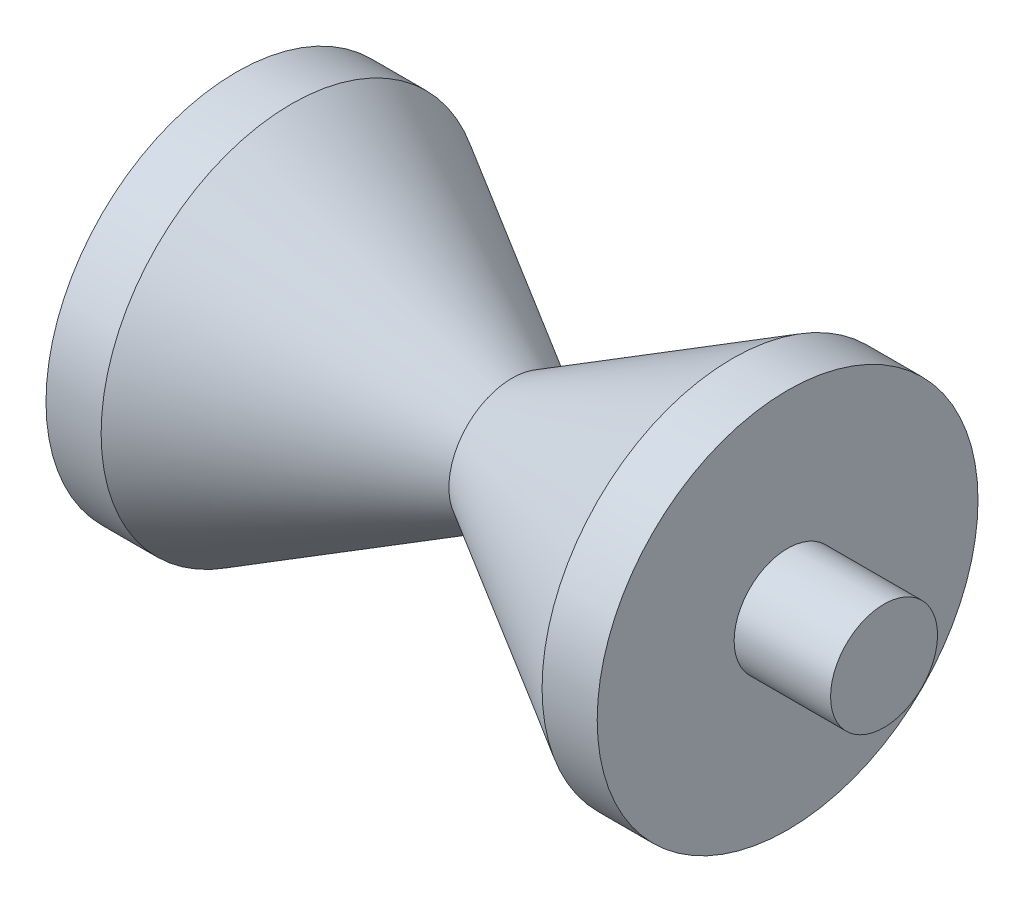
ISO-10303-21;
HEADER;
FILE_DESCRIPTION(('STEP AP214'),'2;1');
FILE_NAME('part.step','',(''),(''),'','','');
FILE_SCHEMA(('AUTOMOTIVE_DESIGN { 1 0 10303 214 1 1 1 1 }'));
ENDSEC;
DATA;
#1=APPLICATION_CONTEXT('core data for automotive mechanical design processes');
#2=APPLICATION_PROTOCOL_DEFINITION('international standard','automotive_design',2000,#1);
#3=PRODUCT_CONTEXT('',#1,'mechanical');
#4=PRODUCT('Part','Part','',(#3));
#5=PRODUCT_RELATED_PRODUCT_CATEGORY('part','',(#4));
#6=PRODUCT_DEFINITION_FORMATION('','',#4);
#7=PRODUCT_DEFINITION_CONTEXT('part definition',#1,'design');
#8=PRODUCT_DEFINITION('design','',#6,#7);
#9=PRODUCT_DEFINITION_SHAPE('','',#8);
#10=(LENGTH_UNIT() NAMED_UNIT(*) SI_UNIT(.MILLI.,.METRE.));
#11=(NAMED_UNIT(*) PLANE_ANGLE_UNIT() SI_UNIT($,.RADIAN.));
#12=(NAMED_UNIT(*) SI_UNIT($,.STERADIAN.) SOLID_ANGLE_UNIT());
#13=UNCERTAINTY_MEASURE_WITH_UNIT(LENGTH_MEASURE(1.E-05),#10,'distance_accuracy_value','');
#14=(GEOMETRIC_REPRESENTATION_CONTEXT(3) GLOBAL_UNCERTAINTY_ASSIGNED_CONTEXT((#13)) GLOBAL_UNIT_ASSIGNED_CONTEXT((#10,
#11,#12)) REPRESENTATION_CONTEXT('',''));
#15=CARTESIAN_POINT('',(0.,0.,0.));
#16=DIRECTION('',(0.,0.,1.));
#17=DIRECTION('',(1.,0.,0.));
#18=AXIS2_PLACEMENT_3D('',#15,#16,#17);
#19=CARTESIAN_POINT('',(6.75,0.,0.));
#20=DIRECTION('',(-1.,0.,0.));
#21=DIRECTION('',(0.,0.,1.));
#22=AXIS2_PLACEMENT_3D('',#19,#20,#21);
#23=PLANE('',#22);
#24=CARTESIAN_POINT('',(6.75,0.,0.));
#25=DIRECTION('',(-1.,0.,0.));
#26=DIRECTION('',(0.,0.,1.));
#27=AXIS2_PLACEMENT_3D('',#24,#25,#26);
#28=CIRCLE('',#27,0.97);
#29=CARTESIAN_POINT('',(6.75,0.,0.97));
#30=VERTEX_POINT('',#29);
#31=EDGE_CURVE('E10',#30,#30,#28,.T.);
#32=ORIENTED_EDGE('',*,*,#31,.F.);
#33=EDGE_LOOP('',(#32));
#34=FACE_BOUND('',#33,.T.);
#35=ADVANCED_FACE('F33',(#34),#23,.F.);
#36=CARTESIAN_POINT('',(0.,0.,0.));
#37=DIRECTION('',(-1.,0.,0.));
#38=DIRECTION('',(0.,0.,1.));
#39=AXIS2_PLACEMENT_3D('',#36,#37,#38);
#40=CYLINDRICAL_SURFACE('',#39,0.97);
#41=CARTESIAN_POINT('',(5.,0.,0.));
#42=DIRECTION('',(-1.,0.,0.));
#43=DIRECTION('',(0.,0.,1.));
#44=AXIS2_PLACEMENT_3D('',#41,#42,#43);
#45=CIRCLE('',#44,0.97);
#46=CARTESIAN_POINT('',(5.,0.,0.97));
#47=VERTEX_POINT('',#46);
#48=EDGE_CURVE('E39',#47,#47,#45,.T.);
#49=ORIENTED_EDGE('',*,*,#48,.F.);
#50=EDGE_LOOP('',(#49));
#51=FACE_BOUND('',#50,.T.);
#52=ORIENTED_EDGE('',*,*,#31,.T.);
#53=EDGE_LOOP('',(#52));
#54=FACE_BOUND('',#53,.T.);
#55=ADVANCED_FACE('F94',(#51,#54),#40,.T.);
#56=CARTESIAN_POINT('',(5.,0.,0.));
#57=DIRECTION('',(-1.,0.,0.));
#58=DIRECTION('',(0.,0.,1.));
#59=AXIS2_PLACEMENT_3D('',#56,#57,#58);
#60=PLANE('',#59);
#61=CARTESIAN_POINT('',(5.,0.,0.));
#62=DIRECTION('',(-1.,0.,0.));
#63=DIRECTION('',(0.,0.,1.));
#64=AXIS2_PLACEMENT_3D('',#61,#62,#63);
#65=CIRCLE('',#64,3.45440107675849);
#66=CARTESIAN_POINT('',(5.,0.,3.45440107675849));
#67=VERTEX_POINT('',#66);
#68=EDGE_CURVE('E43',#67,#67,#65,.T.);
#69=ORIENTED_EDGE('',*,*,#68,.F.);
#70=EDGE_LOOP('',(#69));
#71=FACE_BOUND('',#70,.T.);
#72=ORIENTED_EDGE('',*,*,#48,.T.);
#73=EDGE_LOOP('',(#72));
#74=FACE_BOUND('',#73,.T.);
#75=ADVANCED_FACE('F90',(#71,#74),#60,.F.);
#76=CARTESIAN_POINT('',(0.,0.,0.));
#77=DIRECTION('',(-1.,0.,0.));
#78=DIRECTION('',(0.,0.,1.));
#79=AXIS2_PLACEMENT_3D('',#76,#77,#78);
#80=CYLINDRICAL_SURFACE('',#79,3.45440107675849);
#81=CARTESIAN_POINT('',(4.,0.,0.));
#82=DIRECTION('',(-1.,0.,0.));
#83=DIRECTION('',(0.,0.,1.));
#84=AXIS2_PLACEMENT_3D('',#81,#82,#83);
#85=CIRCLE('',#84,3.45440107675849);
#86=CARTESIAN_POINT('',(4.,0.,-3.45440107675849));
#87=VERTEX_POINT('',#86);
#88=EDGE_CURVE('E47',#87,#87,#85,.T.);
#89=ORIENTED_EDGE('',*,*,#88,.F.);
#90=EDGE_LOOP('',(#89));
#91=FACE_BOUND('',#90,.T.);
#92=ORIENTED_EDGE('',*,*,#68,.T.);
#93=EDGE_LOOP('',(#92));
#94=FACE_BOUND('',#93,.T.);
#95=ADVANCED_FACE('F80',(#91,#94),#80,.T.);
#96=CARTESIAN_POINT('',(0.,0.,0.));
#97=DIRECTION('',(1.,0.,0.));
#98=DIRECTION('',(0.,0.,-1.));
#99=AXIS2_PLACEMENT_3D('',#96,#97,#98);
#100=CONICAL_SURFACE('',#99,1.145,0.523598775598297);
#101=CARTESIAN_POINT('',(0.,0.,0.));
#102=DIRECTION('',(-1.,0.,0.));
#103=DIRECTION('',(0.,0.,1.));
#104=AXIS2_PLACEMENT_3D('',#101,#102,#103);
#105=CIRCLE('',#104,1.145);
#106=CARTESIAN_POINT('',(0.,0.,-1.145));
#107=VERTEX_POINT('',#106);
#108=EDGE_CURVE('E52',#107,#107,#105,.T.);
#109=CARTESIAN_POINT('',(4.,0.,-3.45440107675849));
#110=CARTESIAN_POINT('',(3.95833333333333,0.,-3.43034481554226));
#111=CARTESIAN_POINT('',(3.91666666666667,0.,-3.40628855432602));
#112=CARTESIAN_POINT('',(3.83333333333333,0.,-3.35817603189355));
#113=CARTESIAN_POINT('',(3.79166666666667,0.,-3.33411977067732));
#114=CARTESIAN_POINT('',(3.70833333333333,0.,-3.28600724824485));
#115=CARTESIAN_POINT('',(3.66666666666667,0.,-3.26195098702862));
#116=CARTESIAN_POINT('',(3.58333333333333,0.,-3.21383846459615));
#117=CARTESIAN_POINT('',(3.54166666666667,0.,-3.18978220337991));
#118=CARTESIAN_POINT('',(3.45833333333333,0.,-3.14166968094744));
#119=CARTESIAN_POINT('',(3.41666666666667,0.,-3.11761341973121));
#120=CARTESIAN_POINT('',(3.33333333333333,0.,-3.06950089729874));
#121=CARTESIAN_POINT('',(3.29166666666667,0.,-3.04544463608251));
#122=CARTESIAN_POINT('',(3.20833333333333,0.,-2.99733211365004));
#123=CARTESIAN_POINT('',(3.16666666666667,0.,-2.97327585243381));
#124=CARTESIAN_POINT('',(3.08333333333333,0.,-2.92516333000134));
#125=CARTESIAN_POINT('',(3.04166666666667,0.,-2.9011070687851));
#126=CARTESIAN_POINT('',(2.95833333333333,0.,-2.85299454635263));
#127=CARTESIAN_POINT('',(2.91666666666667,0.,-2.8289382851364));
#128=CARTESIAN_POINT('',(2.83333333333333,0.,-2.78082576270393));
#129=CARTESIAN_POINT('',(2.79166666666667,0.,-2.7567695014877));
#130=CARTESIAN_POINT('',(2.70833333333333,0.,-2.70865697905523));
#131=CARTESIAN_POINT('',(2.66666666666667,0.,-2.68460071783899));
#132=CARTESIAN_POINT('',(2.58333333333333,0.,-2.63648819540653));
#133=CARTESIAN_POINT('',(2.54166666666667,0.,-2.61243193419029));
#134=CARTESIAN_POINT('',(2.45833333333333,0.,-2.56431941175782));
#135=CARTESIAN_POINT('',(2.41666666666667,0.,-2.54026315054159));
#136=CARTESIAN_POINT('',(2.33333333333333,0.,-2.49215062810912));
#137=CARTESIAN_POINT('',(2.29166666666667,0.,-2.46809436689289));
#138=CARTESIAN_POINT('',(2.20833333333333,0.,-2.41998184446042));
#139=CARTESIAN_POINT('',(2.16666666666667,0.,-2.39592558324418));
#140=CARTESIAN_POINT('',(2.08333333333333,0.,-2.34781306081171));
#141=CARTESIAN_POINT('',(2.04166666666667,0.,-2.32375679959548));
#142=CARTESIAN_POINT('',(1.95833333333333,0.,-2.27564427716301));
#143=CARTESIAN_POINT('',(1.91666666666667,0.,-2.25158801594678));
#144=CARTESIAN_POINT('',(1.83333333333333,0.,-2.20347549351431));
#145=CARTESIAN_POINT('',(1.79166666666667,0.,-2.17941923229807));
#146=CARTESIAN_POINT('',(1.70833333333333,0.,-2.1313067098656));
#147=CARTESIAN_POINT('',(1.66666666666667,0.,-2.10725044864937));
#148=CARTESIAN_POINT('',(1.58333333333333,0.,-2.0591379262169));
#149=CARTESIAN_POINT('',(1.54166666666667,0.,-2.03508166500067));
#150=CARTESIAN_POINT('',(1.45833333333333,0.,-1.9869691425682));
#151=CARTESIAN_POINT('',(1.41666666666667,0.,-1.96291288135197));
#152=CARTESIAN_POINT('',(1.33333333333333,0.,-1.9148003589195));
#153=CARTESIAN_POINT('',(1.29166666666667,0.,-1.89074409770326));
#154=CARTESIAN_POINT('',(1.20833333333333,0.,-1.84263157527079));
#155=CARTESIAN_POINT('',(1.16666666666667,0.,-1.81857531405456));
#156=CARTESIAN_POINT('',(1.08333333333333,0.,-1.77046279162209));
#157=CARTESIAN_POINT('',(1.04166666666667,0.,-1.74640653040586));
#158=CARTESIAN_POINT('',(0.958333333333333,0.,-1.69829400797339));
#159=CARTESIAN_POINT('',(0.916666666666667,0.,-1.67423774675715));
#160=CARTESIAN_POINT('',(0.833333333333333,0.,-1.62612522432469));
#161=CARTESIAN_POINT('',(0.791666666666667,0.,-1.60206896310845));
#162=CARTESIAN_POINT('',(0.708333333333333,0.,-1.55395644067598));
#163=CARTESIAN_POINT('',(0.666666666666667,0.,-1.52990017945975));
#164=CARTESIAN_POINT('',(0.583333333333333,0.,-1.48178765702728));
#165=CARTESIAN_POINT('',(0.541666666666667,0.,-1.45773139581105));
#166=CARTESIAN_POINT('',(0.458333333333333,0.,-1.40961887337858));
#167=CARTESIAN_POINT('',(0.416666666666667,0.,-1.38556261216234));
#168=CARTESIAN_POINT('',(0.333333333333333,0.,-1.33745008972987));
#169=CARTESIAN_POINT('',(0.291666666666667,0.,-1.31339382851364));
#170=CARTESIAN_POINT('',(0.208333333333334,0.,-1.26528130608117));
#171=CARTESIAN_POINT('',(0.166666666666667,0.,-1.24122504486494));
#172=CARTESIAN_POINT('',(0.0833333333333334,0.,-1.19311252243247));
#173=CARTESIAN_POINT('',(0.0416666666666667,0.,-1.16905626121623));
#174=CARTESIAN_POINT('',(0.,0.,-1.145));
#175=B_SPLINE_CURVE_WITH_KNOTS('',3,(#109,#110,#111,#112,#113,#114,#115,#116,#117,#118,#119,
#120,#121,#122,#123,#124,#125,#126,#127,#128,#129,#130,#131,#132,#133,#134,#135,#136,#137,#138,
#139,#140,#141,#142,#143,#144,#145,#146,#147,#148,#149,#150,#151,#152,#153,#154,#155,#156,#157,
#158,#159,#160,#161,#162,#163,#164,#165,#166,#167,#168,#169,#170,#171,#172,#173,#174),
.UNSPECIFIED.,.F.,.F.,(4,2,2,2,2,2,2,2,2,2,2,2,2,2,2,2,2,2,2,2,2,2,2,2,2,2,2,2,2,2,2,2,4),(0.,
0.144337567297406,0.288675134594813,0.433012701892218,0.577350269189625,0.721687836487031,
0.866025403784437,1.01036297108184,1.15470053837925,1.29903810567666,1.44337567297406,
1.58771324027147,1.73205080756887,1.87638837486628,2.02072594216369,2.16506350946109,
2.3094010767585,2.45373864405591,2.59807621135331,2.74241377865072,2.88675134594813,
3.03108891324553,3.17542648054294,3.31976404784034,3.46410161513775,3.60843918243516,
3.75277674973256,3.89711431702997,4.04145188432738,4.18578945162478,4.33012701892219,
4.47446458621959,4.618802153517),.UNSPECIFIED.);
#176=EDGE_CURVE('BSEAM77',#87,#107,#175,.T.);
#177=ORIENTED_EDGE('',*,*,#88,.T.);
#178=ORIENTED_EDGE('',*,*,#108,.F.);
#179=ORIENTED_EDGE('',*,*,#176,.T.);
#180=ORIENTED_EDGE('',*,*,#176,.F.);
#181=EDGE_LOOP('',(#177,#179,#178,#180));
#182=FACE_BOUND('',#181,.T.);
#183=ADVANCED_FACE('F77',(#182),#100,.T.);
#184=CARTESIAN_POINT('',(-6.75,0.,0.));
#185=DIRECTION('',(1.,0.,0.));
#186=DIRECTION('',(0.,0.,1.));
#187=AXIS2_PLACEMENT_3D('',#184,#185,#186);
#188=PLANE('',#187);
#189=CARTESIAN_POINT('',(-6.75,0.,0.));
#190=DIRECTION('',(-1.,0.,0.));
#191=DIRECTION('',(0.,0.,1.));
#192=AXIS2_PLACEMENT_3D('',#189,#190,#191);
#193=CIRCLE('',#192,0.97);
#194=CARTESIAN_POINT('',(-6.75,0.,0.97));
#195=VERTEX_POINT('',#194);
#196=EDGE_CURVE('E55',#195,#195,#193,.T.);
#197=ORIENTED_EDGE('',*,*,#196,.T.);
#198=EDGE_LOOP('',(#197));
#199=FACE_BOUND('',#198,.T.);
#200=ADVANCED_FACE('F79',(#199),#188,.F.);
#201=CARTESIAN_POINT('',(0.,0.,0.));
#202=DIRECTION('',(1.,0.,0.));
#203=DIRECTION('',(0.,0.,1.));
#204=AXIS2_PLACEMENT_3D('',#201,#202,#203);
#205=CYLINDRICAL_SURFACE('',#204,0.97);
#206=CARTESIAN_POINT('',(-5.,0.,0.));
#207=DIRECTION('',(-1.,0.,0.));
#208=DIRECTION('',(0.,0.,1.));
#209=AXIS2_PLACEMENT_3D('',#206,#207,#208);
#210=CIRCLE('',#209,0.97);
#211=CARTESIAN_POINT('',(-5.,0.,0.97));
#212=VERTEX_POINT('',#211);
#213=EDGE_CURVE('E58',#212,#212,#210,.T.);
#214=ORIENTED_EDGE('',*,*,#213,.T.);
#215=EDGE_LOOP('',(#214));
#216=FACE_BOUND('',#215,.T.);
#217=ORIENTED_EDGE('',*,*,#196,.F.);
#218=EDGE_LOOP('',(#217));
#219=FACE_BOUND('',#218,.T.);
#220=ADVANCED_FACE('F87',(#216,#219),#205,.T.);
#221=CARTESIAN_POINT('',(-5.,0.,0.));
#222=DIRECTION('',(1.,0.,0.));
#223=DIRECTION('',(0.,0.,1.));
#224=AXIS2_PLACEMENT_3D('',#221,#222,#223);
#225=PLANE('',#224);
#226=CARTESIAN_POINT('',(-5.,0.,0.));
#227=DIRECTION('',(-1.,0.,0.));
#228=DIRECTION('',(0.,0.,1.));
#229=AXIS2_PLACEMENT_3D('',#226,#227,#228);
#230=CIRCLE('',#229,3.45440107675849);
#231=CARTESIAN_POINT('',(-5.,0.,3.45440107675849));
#232=VERTEX_POINT('',#231);
#233=EDGE_CURVE('E61',#232,#232,#230,.T.);
#234=ORIENTED_EDGE('',*,*,#233,.T.);
#235=EDGE_LOOP('',(#234));
#236=FACE_BOUND('',#235,.T.);
#237=ORIENTED_EDGE('',*,*,#213,.F.);
#238=EDGE_LOOP('',(#237));
#239=FACE_BOUND('',#238,.T.);
#240=ADVANCED_FACE('F132',(#236,#239),#225,.F.);
#241=CARTESIAN_POINT('',(0.,0.,0.));
#242=DIRECTION('',(1.,0.,0.));
#243=DIRECTION('',(0.,0.,1.));
#244=AXIS2_PLACEMENT_3D('',#241,#242,#243);
#245=CYLINDRICAL_SURFACE('',#244,3.45440107675849);
#246=CARTESIAN_POINT('',(-4.,0.,0.));
#247=DIRECTION('',(-1.,0.,0.));
#248=DIRECTION('',(0.,0.,1.));
#249=AXIS2_PLACEMENT_3D('',#246,#247,#248);
#250=CIRCLE('',#249,3.45440107675849);
#251=CARTESIAN_POINT('',(-4.,0.,-3.45440107675849));
#252=VERTEX_POINT('',#251);
#253=EDGE_CURVE('E64',#252,#252,#250,.T.);
#254=ORIENTED_EDGE('',*,*,#253,.T.);
#255=EDGE_LOOP('',(#254));
#256=FACE_BOUND('',#255,.T.);
#257=ORIENTED_EDGE('',*,*,#233,.F.);
#258=EDGE_LOOP('',(#257));
#259=FACE_BOUND('',#258,.T.);
#260=ADVANCED_FACE('F68',(#256,#259),#245,.T.);
#261=CARTESIAN_POINT('',(0.,0.,0.));
#262=DIRECTION('',(-1.,0.,0.));
#263=DIRECTION('',(0.,0.,-1.));
#264=AXIS2_PLACEMENT_3D('',#261,#262,#263);
#265=CONICAL_SURFACE('',#264,1.145,0.523598775598297);
#266=CARTESIAN_POINT('',(-4.,0.,-3.45440107675849));
#267=CARTESIAN_POINT('',(-3.95833333333333,0.,-3.43034481554226));
#268=CARTESIAN_POINT('',(-3.91666666666667,0.,-3.40628855432602));
#269=CARTESIAN_POINT('',(-3.83333333333333,0.,-3.35817603189355));
#270=CARTESIAN_POINT('',(-3.79166666666667,0.,-3.33411977067732));
#271=CARTESIAN_POINT('',(-3.70833333333333,0.,-3.28600724824485));
#272=CARTESIAN_POINT('',(-3.66666666666667,0.,-3.26195098702862));
#273=CARTESIAN_POINT('',(-3.58333333333333,0.,-3.21383846459615));
#274=CARTESIAN_POINT('',(-3.54166666666667,0.,-3.18978220337991));
#275=CARTESIAN_POINT('',(-3.45833333333333,0.,-3.14166968094744));
#276=CARTESIAN_POINT('',(-3.41666666666667,0.,-3.11761341973121));
#277=CARTESIAN_POINT('',(-3.33333333333333,0.,-3.06950089729874));
#278=CARTESIAN_POINT('',(-3.29166666666667,0.,-3.04544463608251));
#279=CARTESIAN_POINT('',(-3.20833333333333,0.,-2.99733211365004));
#280=CARTESIAN_POINT('',(-3.16666666666667,0.,-2.97327585243381));
#281=CARTESIAN_POINT('',(-3.08333333333333,0.,-2.92516333000134));
#282=CARTESIAN_POINT('',(-3.04166666666667,0.,-2.9011070687851));
#283=CARTESIAN_POINT('',(-2.95833333333333,0.,-2.85299454635263));
#284=CARTESIAN_POINT('',(-2.91666666666667,0.,-2.8289382851364));
#285=CARTESIAN_POINT('',(-2.83333333333333,0.,-2.78082576270393));
#286=CARTESIAN_POINT('',(-2.79166666666667,0.,-2.7567695014877));
#287=CARTESIAN_POINT('',(-2.70833333333333,0.,-2.70865697905523));
#288=CARTESIAN_POINT('',(-2.66666666666667,0.,-2.68460071783899));
#289=CARTESIAN_POINT('',(-2.58333333333333,0.,-2.63648819540653));
#290=CARTESIAN_POINT('',(-2.54166666666667,0.,-2.61243193419029));
#291=CARTESIAN_POINT('',(-2.45833333333333,0.,-2.56431941175782));
#292=CARTESIAN_POINT('',(-2.41666666666667,0.,-2.54026315054159));
#293=CARTESIAN_POINT('',(-2.33333333333333,0.,-2.49215062810912));
#294=CARTESIAN_POINT('',(-2.29166666666667,0.,-2.46809436689289));
#295=CARTESIAN_POINT('',(-2.20833333333333,0.,-2.41998184446042));
#296=CARTESIAN_POINT('',(-2.16666666666667,0.,-2.39592558324418));
#297=CARTESIAN_POINT('',(-2.08333333333333,0.,-2.34781306081171));
#298=CARTESIAN_POINT('',(-2.04166666666667,0.,-2.32375679959548));
#299=CARTESIAN_POINT('',(-1.95833333333333,0.,-2.27564427716301));
#300=CARTESIAN_POINT('',(-1.91666666666667,0.,-2.25158801594678));
#301=CARTESIAN_POINT('',(-1.83333333333333,0.,-2.20347549351431));
#302=CARTESIAN_POINT('',(-1.79166666666667,0.,-2.17941923229807));
#303=CARTESIAN_POINT('',(-1.70833333333333,0.,-2.1313067098656));
#304=CARTESIAN_POINT('',(-1.66666666666667,0.,-2.10725044864937));
#305=CARTESIAN_POINT('',(-1.58333333333333,0.,-2.0591379262169));
#306=CARTESIAN_POINT('',(-1.54166666666667,0.,-2.03508166500067));
#307=CARTESIAN_POINT('',(-1.45833333333333,0.,-1.9869691425682));
#308=CARTESIAN_POINT('',(-1.41666666666667,0.,-1.96291288135197));
#309=CARTESIAN_POINT('',(-1.33333333333333,0.,-1.9148003589195));
#310=CARTESIAN_POINT('',(-1.29166666666667,0.,-1.89074409770326));
#311=CARTESIAN_POINT('',(-1.20833333333333,0.,-1.84263157527079));
#312=CARTESIAN_POINT('',(-1.16666666666667,0.,-1.81857531405456));
#313=CARTESIAN_POINT('',(-1.08333333333333,0.,-1.77046279162209));
#314=CARTESIAN_POINT('',(-1.04166666666667,0.,-1.74640653040586));
#315=CARTESIAN_POINT('',(-0.958333333333333,0.,-1.69829400797339));
#316=CARTESIAN_POINT('',(-0.916666666666667,0.,-1.67423774675715));
#317=CARTESIAN_POINT('',(-0.833333333333333,0.,-1.62612522432469));
#318=CARTESIAN_POINT('',(-0.791666666666667,0.,-1.60206896310845));
#319=CARTESIAN_POINT('',(-0.708333333333333,0.,-1.55395644067598));
#320=CARTESIAN_POINT('',(-0.666666666666667,0.,-1.52990017945975));
#321=CARTESIAN_POINT('',(-0.583333333333333,0.,-1.48178765702728));
#322=CARTESIAN_POINT('',(-0.541666666666667,0.,-1.45773139581105));
#323=CARTESIAN_POINT('',(-0.458333333333333,0.,-1.40961887337858));
#324=CARTESIAN_POINT('',(-0.416666666666667,0.,-1.38556261216234));
#325=CARTESIAN_POINT('',(-0.333333333333333,0.,-1.33745008972987));
#326=CARTESIAN_POINT('',(-0.291666666666667,0.,-1.31339382851364));
#327=CARTESIAN_POINT('',(-0.208333333333334,0.,-1.26528130608117));
#328=CARTESIAN_POINT('',(-0.166666666666667,0.,-1.24122504486494));
#329=CARTESIAN_POINT('',(-0.0833333333333334,0.,-1.19311252243247));
#330=CARTESIAN_POINT('',(-0.0416666666666667,0.,-1.16905626121623));
#331=CARTESIAN_POINT('',(0.,0.,-1.145));
#332=B_SPLINE_CURVE_WITH_KNOTS('',3,(#266,#267,#268,#269,#270,#271,#272,#273,#274,#275,#276,
#277,#278,#279,#280,#281,#282,#283,#284,#285,#286,#287,#288,#289,#290,#291,#292,#293,#294,#295,
#296,#297,#298,#299,#300,#301,#302,#303,#304,#305,#306,#307,#308,#309,#310,#311,#312,#313,#314,
#315,#316,#317,#318,#319,#320,#321,#322,#323,#324,#325,#326,#327,#328,#329,#330,#331),
.UNSPECIFIED.,.F.,.F.,(4,2,2,2,2,2,2,2,2,2,2,2,2,2,2,2,2,2,2,2,2,2,2,2,2,2,2,2,2,2,2,2,4),(0.,
0.144337567297406,0.288675134594813,0.433012701892218,0.577350269189625,0.721687836487031,
0.866025403784437,1.01036297108184,1.15470053837925,1.29903810567666,1.44337567297406,
1.58771324027147,1.73205080756887,1.87638837486628,2.02072594216369,2.16506350946109,
2.3094010767585,2.45373864405591,2.59807621135331,2.74241377865072,2.88675134594813,
3.03108891324553,3.17542648054294,3.31976404784034,3.46410161513775,3.60843918243516,
3.75277674973256,3.89711431702997,4.04145188432738,4.18578945162478,4.33012701892219,
4.47446458621959,4.618802153517),.UNSPECIFIED.);
#333=EDGE_CURVE('BSEAM71',#252,#107,#332,.T.);
#334=ORIENTED_EDGE('',*,*,#253,.F.);
#335=ORIENTED_EDGE('',*,*,#108,.T.);
#336=ORIENTED_EDGE('',*,*,#333,.T.);
#337=ORIENTED_EDGE('',*,*,#333,.F.);
#338=EDGE_LOOP('',(#334,#336,#335,#337));
#339=FACE_BOUND('',#338,.T.);
#340=ADVANCED_FACE('F71',(#339),#265,.T.);
#341=CLOSED_SHELL('',(#35,#55,#75,#95,#183,#200,#220,#240,#260,#340));
#342=MANIFOLD_SOLID_BREP('B2',#341);
#343=ADVANCED_BREP_SHAPE_REPRESENTATION('',(#18,#342),#14);
#344=SHAPE_DEFINITION_REPRESENTATION(#9,#343);
ENDSEC;
END-ISO-10303-21;
